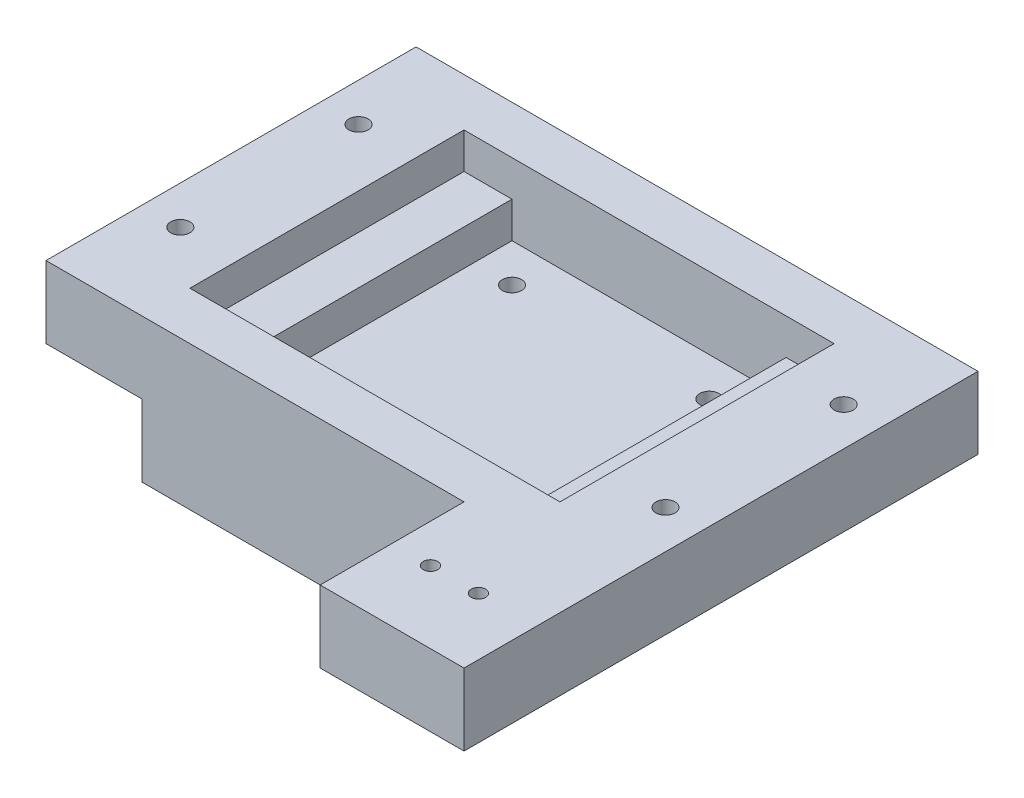
ISO-10303-21;
HEADER;
FILE_DESCRIPTION(('STEP AP214'),'2;1');
FILE_NAME('part.step','',(''),(''),'','','');
FILE_SCHEMA(('AUTOMOTIVE_DESIGN { 1 0 10303 214 1 1 1 1 }'));
ENDSEC;
DATA;
#1=APPLICATION_CONTEXT('core data for automotive mechanical design processes');
#2=APPLICATION_PROTOCOL_DEFINITION('international standard','automotive_design',2000,#1);
#3=PRODUCT_CONTEXT('',#1,'mechanical');
#4=PRODUCT('Part','Part','',(#3));
#5=PRODUCT_RELATED_PRODUCT_CATEGORY('part','',(#4));
#6=PRODUCT_DEFINITION_FORMATION('','',#4);
#7=PRODUCT_DEFINITION_CONTEXT('part definition',#1,'design');
#8=PRODUCT_DEFINITION('design','',#6,#7);
#9=PRODUCT_DEFINITION_SHAPE('','',#8);
#10=(LENGTH_UNIT() NAMED_UNIT(*) SI_UNIT(.MILLI.,.METRE.));
#11=(NAMED_UNIT(*) PLANE_ANGLE_UNIT() SI_UNIT($,.RADIAN.));
#12=(NAMED_UNIT(*) SI_UNIT($,.STERADIAN.) SOLID_ANGLE_UNIT());
#13=UNCERTAINTY_MEASURE_WITH_UNIT(LENGTH_MEASURE(1.E-05),#10,'distance_accuracy_value','');
#14=(GEOMETRIC_REPRESENTATION_CONTEXT(3) GLOBAL_UNCERTAINTY_ASSIGNED_CONTEXT((#13)) GLOBAL_UNIT_ASSIGNED_CONTEXT((#10,
#11,#12)) REPRESENTATION_CONTEXT('',''));
#15=CARTESIAN_POINT('',(0.,0.,0.));
#16=DIRECTION('',(0.,0.,1.));
#17=DIRECTION('',(1.,0.,0.));
#18=AXIS2_PLACEMENT_3D('',#15,#16,#17);
#19=CARTESIAN_POINT('',(0.,15.,0.));
#20=DIRECTION('',(0.,1.,0.));
#21=DIRECTION('',(0.,0.,1.));
#22=AXIS2_PLACEMENT_3D('',#19,#20,#21);
#23=PLANE('',#22);
#24=CARTESIAN_POINT('',(-50.575,15.,18.575));
#25=DIRECTION('',(0.,1.,0.));
#26=DIRECTION('',(0.,0.,1.));
#27=AXIS2_PLACEMENT_3D('',#24,#25,#26);
#28=CIRCLE('',#27,2.);
#29=CARTESIAN_POINT('',(-50.575,15.,20.575));
#30=VERTEX_POINT('',#29);
#31=EDGE_CURVE('E342',#30,#30,#28,.T.);
#32=ORIENTED_EDGE('',*,*,#31,.T.);
#33=EDGE_LOOP('',(#32));
#34=FACE_BOUND('',#33,.T.);
#35=CARTESIAN_POINT('',(-50.575,15.,-18.575));
#36=DIRECTION('',(0.,1.,0.));
#37=DIRECTION('',(0.,0.,1.));
#38=AXIS2_PLACEMENT_3D('',#35,#36,#37);
#39=CIRCLE('',#38,2.);
#40=CARTESIAN_POINT('',(-50.575,15.,-16.575));
#41=VERTEX_POINT('',#40);
#42=EDGE_CURVE('E229',#41,#41,#39,.T.);
#43=ORIENTED_EDGE('',*,*,#42,.T.);
#44=EDGE_LOOP('',(#43));
#45=FACE_BOUND('',#44,.T.);
#46=DIRECTION('',(0.,0.,1.));
#47=VECTOR('',#46,1.);
#48=CARTESIAN_POINT('',(-38.575,15.,0.));
#49=LINE('',#48,#47);
#50=CARTESIAN_POINT('',(-38.575,15.,-38.575));
#51=VERTEX_POINT('',#50);
#52=CARTESIAN_POINT('',(-38.575,15.,38.575));
#53=VERTEX_POINT('',#52);
#54=EDGE_CURVE('E295',#51,#53,#49,.T.);
#55=ORIENTED_EDGE('',*,*,#54,.T.);
#56=DIRECTION('',(-1.,0.,0.));
#57=VECTOR('',#56,1.);
#58=CARTESIAN_POINT('',(0.,15.,38.575));
#59=LINE('',#58,#57);
#60=CARTESIAN_POINT('',(-58.575,15.,38.575));
#61=VERTEX_POINT('',#60);
#62=EDGE_CURVE('E11',#53,#61,#59,.T.);
#63=ORIENTED_EDGE('',*,*,#62,.T.);
#64=DIRECTION('',(0.,0.,1.));
#65=VECTOR('',#64,1.);
#66=CARTESIAN_POINT('',(-58.575,15.,0.));
#67=LINE('',#66,#65);
#68=CARTESIAN_POINT('',(-58.575,15.,-38.575));
#69=VERTEX_POINT('',#68);
#70=EDGE_CURVE('E283',#69,#61,#67,.T.);
#71=ORIENTED_EDGE('',*,*,#70,.F.);
#72=DIRECTION('',(-1.,0.,0.));
#73=VECTOR('',#72,1.);
#74=CARTESIAN_POINT('',(0.,15.,-38.575));
#75=LINE('',#74,#73);
#76=EDGE_CURVE('E288',#51,#69,#75,.T.);
#77=ORIENTED_EDGE('',*,*,#76,.F.);
#78=EDGE_LOOP('',(#55,#63,#71,#77));
#79=FACE_BOUND('',#78,.T.);
#80=ADVANCED_FACE('F35',(#34,#45,#79),#23,.F.);
#81=CARTESIAN_POINT('',(-38.575,15.,38.575));
#82=DIRECTION('',(0.,0.,-1.));
#83=DIRECTION('',(-1.,0.,0.));
#84=AXIS2_PLACEMENT_3D('',#81,#82,#83);
#85=PLANE('',#84);
#86=DIRECTION('',(1.,0.,0.));
#87=VECTOR('',#86,1.);
#88=CARTESIAN_POINT('',(-58.575,15.,38.575));
#89=LINE('',#88,#87);
#90=CARTESIAN_POINT('',(28.575,15.,38.575));
#91=VERTEX_POINT('',#90);
#92=CARTESIAN_POINT('',(38.575,15.,38.575));
#93=VERTEX_POINT('',#92);
#94=EDGE_CURVE('E167',#91,#93,#89,.T.);
#95=ORIENTED_EDGE('',*,*,#94,.F.);
#96=DIRECTION('',(0.,1.,0.));
#97=VECTOR('',#96,1.);
#98=CARTESIAN_POINT('',(28.575,-10.,38.575));
#99=LINE('',#98,#97);
#100=CARTESIAN_POINT('',(28.575,30.,38.575));
#101=VERTEX_POINT('',#100);
#102=EDGE_CURVE('E507',#91,#101,#99,.T.);
#103=ORIENTED_EDGE('',*,*,#102,.T.);
#104=DIRECTION('',(-1.,0.,0.));
#105=VECTOR('',#104,1.);
#106=CARTESIAN_POINT('',(28.575,30.,38.575));
#107=LINE('',#106,#105);
#108=CARTESIAN_POINT('',(-58.575,30.,38.575));
#109=VERTEX_POINT('',#108);
#110=EDGE_CURVE('E175',#101,#109,#107,.T.);
#111=ORIENTED_EDGE('',*,*,#110,.T.);
#112=DIRECTION('',(0.,1.,0.));
#113=VECTOR('',#112,1.);
#114=CARTESIAN_POINT('',(-58.575,-10.,38.575));
#115=LINE('',#114,#113);
#116=EDGE_CURVE('E185',#61,#109,#115,.T.);
#117=ORIENTED_EDGE('',*,*,#116,.F.);
#118=ORIENTED_EDGE('',*,*,#62,.F.);
#119=DIRECTION('',(0.,-1.,0.));
#120=VECTOR('',#119,1.);
#121=CARTESIAN_POINT('',(-38.575,15.,38.575));
#122=LINE('',#121,#120);
#123=CARTESIAN_POINT('',(-38.575,0.,38.575));
#124=VERTEX_POINT('',#123);
#125=EDGE_CURVE('E192',#53,#124,#122,.T.);
#126=ORIENTED_EDGE('',*,*,#125,.T.);
#127=DIRECTION('',(1.,0.,0.));
#128=VECTOR('',#127,1.);
#129=CARTESIAN_POINT('',(-38.575,0.,38.575));
#130=LINE('',#129,#128);
#131=CARTESIAN_POINT('',(38.575,0.,38.575));
#132=VERTEX_POINT('',#131);
#133=EDGE_CURVE('E310',#124,#132,#130,.T.);
#134=ORIENTED_EDGE('',*,*,#133,.T.);
#135=DIRECTION('',(0.,-1.,0.));
#136=VECTOR('',#135,1.);
#137=CARTESIAN_POINT('',(38.575,15.,38.575));
#138=LINE('',#137,#136);
#139=EDGE_CURVE('E322',#93,#132,#138,.T.);
#140=ORIENTED_EDGE('',*,*,#139,.F.);
#141=EDGE_LOOP('',(#95,#103,#111,#117,#118,#126,#134,#140));
#142=FACE_BOUND('',#141,.T.);
#143=ADVANCED_FACE('F368',(#142),#85,.F.);
#144=CARTESIAN_POINT('',(-38.575,15.,38.575));
#145=DIRECTION('',(1.,0.,0.));
#146=DIRECTION('',(0.,0.,-1.));
#147=AXIS2_PLACEMENT_3D('',#144,#145,#146);
#148=PLANE('',#147);
#149=ORIENTED_EDGE('',*,*,#125,.F.);
#150=ORIENTED_EDGE('',*,*,#54,.F.);
#151=DIRECTION('',(0.,-1.,0.));
#152=VECTOR('',#151,1.);
#153=CARTESIAN_POINT('',(-38.575,15.,-38.575));
#154=LINE('',#153,#152);
#155=CARTESIAN_POINT('',(-38.575,0.,-38.575));
#156=VERTEX_POINT('',#155);
#157=EDGE_CURVE('E317',#51,#156,#154,.T.);
#158=ORIENTED_EDGE('',*,*,#157,.T.);
#159=DIRECTION('',(0.,0.,1.));
#160=VECTOR('',#159,1.);
#161=CARTESIAN_POINT('',(-38.575,0.,38.575));
#162=LINE('',#161,#160);
#163=EDGE_CURVE('E307',#156,#124,#162,.T.);
#164=ORIENTED_EDGE('',*,*,#163,.T.);
#165=EDGE_LOOP('',(#149,#150,#158,#164));
#166=FACE_BOUND('',#165,.T.);
#167=ADVANCED_FACE('F37',(#166),#148,.F.);
#168=CARTESIAN_POINT('',(0.,15.,0.));
#169=DIRECTION('',(0.,-1.,0.));
#170=DIRECTION('',(0.,0.,-1.));
#171=AXIS2_PLACEMENT_3D('',#168,#169,#170);
#172=PLANE('',#171);
#173=CARTESIAN_POINT('',(-20.575,15.,-20.575));
#174=DIRECTION('',(0.,1.,0.));
#175=DIRECTION('',(0.,0.,1.));
#176=AXIS2_PLACEMENT_3D('',#173,#174,#175);
#177=CIRCLE('',#176,2.00000000000001);
#178=CARTESIAN_POINT('',(-20.575,15.,-18.575));
#179=VERTEX_POINT('',#178);
#180=EDGE_CURVE('E230',#179,#179,#177,.T.);
#181=ORIENTED_EDGE('',*,*,#180,.F.);
#182=EDGE_LOOP('',(#181));
#183=FACE_BOUND('',#182,.T.);
#184=CARTESIAN_POINT('',(20.575,15.,20.575));
#185=DIRECTION('',(0.,1.,0.));
#186=DIRECTION('',(0.,0.,1.));
#187=AXIS2_PLACEMENT_3D('',#184,#185,#186);
#188=CIRCLE('',#187,2.);
#189=CARTESIAN_POINT('',(20.575,15.,22.575));
#190=VERTEX_POINT('',#189);
#191=EDGE_CURVE('E228',#190,#190,#188,.T.);
#192=ORIENTED_EDGE('',*,*,#191,.F.);
#193=EDGE_LOOP('',(#192));
#194=FACE_BOUND('',#193,.T.);
#195=CARTESIAN_POINT('',(-20.575,15.,20.575));
#196=DIRECTION('',(0.,1.,0.));
#197=DIRECTION('',(0.,0.,1.));
#198=AXIS2_PLACEMENT_3D('',#195,#196,#197);
#199=CIRCLE('',#198,2.00000000000001);
#200=CARTESIAN_POINT('',(-20.575,15.,22.575));
#201=VERTEX_POINT('',#200);
#202=EDGE_CURVE('E225',#201,#201,#199,.T.);
#203=ORIENTED_EDGE('',*,*,#202,.F.);
#204=EDGE_LOOP('',(#203));
#205=FACE_BOUND('',#204,.T.);
#206=CARTESIAN_POINT('',(20.575,15.,-20.575));
#207=DIRECTION('',(0.,1.,0.));
#208=DIRECTION('',(0.,0.,1.));
#209=AXIS2_PLACEMENT_3D('',#206,#207,#208);
#210=CIRCLE('',#209,2.);
#211=CARTESIAN_POINT('',(20.575,15.,-18.575));
#212=VERTEX_POINT('',#211);
#213=EDGE_CURVE('E233',#212,#212,#210,.T.);
#214=ORIENTED_EDGE('',*,*,#213,.F.);
#215=EDGE_LOOP('',(#214));
#216=FACE_BOUND('',#215,.T.);
#217=DIRECTION('',(0.,0.,-1.));
#218=VECTOR('',#217,1.);
#219=CARTESIAN_POINT('',(28.575,15.,0.));
#220=LINE('',#219,#218);
#221=CARTESIAN_POINT('',(28.575,15.,28.575));
#222=VERTEX_POINT('',#221);
#223=CARTESIAN_POINT('',(28.575,15.,-28.575));
#224=VERTEX_POINT('',#223);
#225=EDGE_CURVE('E277',#222,#224,#220,.T.);
#226=ORIENTED_EDGE('',*,*,#225,.T.);
#227=DIRECTION('',(-1.,0.,0.));
#228=VECTOR('',#227,1.);
#229=CARTESIAN_POINT('',(0.,15.,-28.575));
#230=LINE('',#229,#228);
#231=CARTESIAN_POINT('',(-28.575,15.,-28.575));
#232=VERTEX_POINT('',#231);
#233=EDGE_CURVE('E58',#224,#232,#230,.T.);
#234=ORIENTED_EDGE('',*,*,#233,.T.);
#235=DIRECTION('',(0.,0.,-1.));
#236=VECTOR('',#235,1.);
#237=CARTESIAN_POINT('',(-28.575,15.,0.));
#238=LINE('',#237,#236);
#239=CARTESIAN_POINT('',(-28.575,15.,28.575));
#240=VERTEX_POINT('',#239);
#241=EDGE_CURVE('E301',#240,#232,#238,.T.);
#242=ORIENTED_EDGE('',*,*,#241,.F.);
#243=DIRECTION('',(1.,0.,0.));
#244=VECTOR('',#243,1.);
#245=CARTESIAN_POINT('',(0.,15.,28.575));
#246=LINE('',#245,#244);
#247=EDGE_CURVE('E250',#240,#222,#246,.T.);
#248=ORIENTED_EDGE('',*,*,#247,.T.);
#249=EDGE_LOOP('',(#226,#234,#242,#248));
#250=FACE_BOUND('',#249,.T.);
#251=ADVANCED_FACE('F457',(#183,#194,#205,#216,#250),#172,.F.);
#252=CARTESIAN_POINT('',(38.575,15.,38.575));
#253=DIRECTION('',(-1.,0.,0.));
#254=DIRECTION('',(0.,0.,1.));
#255=AXIS2_PLACEMENT_3D('',#252,#253,#254);
#256=PLANE('',#255);
#257=DIRECTION('',(0.,0.,-1.));
#258=VECTOR('',#257,1.);
#259=CARTESIAN_POINT('',(38.575,0.,38.575));
#260=LINE('',#259,#258);
#261=CARTESIAN_POINT('',(38.575,0.,-38.575));
#262=VERTEX_POINT('',#261);
#263=EDGE_CURVE('E312',#132,#262,#260,.T.);
#264=ORIENTED_EDGE('',*,*,#263,.T.);
#265=DIRECTION('',(0.,-1.,0.));
#266=VECTOR('',#265,1.);
#267=CARTESIAN_POINT('',(38.575,15.,-38.575));
#268=LINE('',#267,#266);
#269=CARTESIAN_POINT('',(38.575,15.,-38.575));
#270=VERTEX_POINT('',#269);
#271=EDGE_CURVE('E319',#270,#262,#268,.T.);
#272=ORIENTED_EDGE('',*,*,#271,.F.);
#273=DIRECTION('',(0.,0.,1.));
#274=VECTOR('',#273,1.);
#275=CARTESIAN_POINT('',(38.575,15.,0.));
#276=LINE('',#275,#274);
#277=EDGE_CURVE('E266',#270,#93,#276,.T.);
#278=ORIENTED_EDGE('',*,*,#277,.T.);
#279=ORIENTED_EDGE('',*,*,#139,.T.);
#280=EDGE_LOOP('',(#264,#272,#278,#279));
#281=FACE_BOUND('',#280,.T.);
#282=ADVANCED_FACE('F459',(#281),#256,.F.);
#283=CARTESIAN_POINT('',(-38.575,15.,-38.575));
#284=DIRECTION('',(0.,0.,1.));
#285=DIRECTION('',(1.,0.,0.));
#286=AXIS2_PLACEMENT_3D('',#283,#284,#285);
#287=PLANE('',#286);
#288=CARTESIAN_POINT('',(0.,20.,-38.575));
#289=DIRECTION('',(0.,0.,-1.));
#290=DIRECTION('',(-1.,0.,0.));
#291=AXIS2_PLACEMENT_3D('',#288,#289,#290);
#292=CIRCLE('',#291,1.25);
#293=CARTESIAN_POINT('',(-1.25000000000001,20.,-38.575));
#294=VERTEX_POINT('',#293);
#295=EDGE_CURVE('E488',#294,#294,#292,.T.);
#296=ORIENTED_EDGE('',*,*,#295,.F.);
#297=EDGE_LOOP('',(#296));
#298=FACE_BOUND('',#297,.T.);
#299=DIRECTION('',(-1.,0.,0.));
#300=VECTOR('',#299,1.);
#301=CARTESIAN_POINT('',(0.,30.,-38.575));
#302=LINE('',#301,#300);
#303=CARTESIAN_POINT('',(58.575,30.,-38.575));
#304=VERTEX_POINT('',#303);
#305=CARTESIAN_POINT('',(-58.575,30.,-38.575));
#306=VERTEX_POINT('',#305);
#307=EDGE_CURVE('E290',#304,#306,#302,.T.);
#308=ORIENTED_EDGE('',*,*,#307,.F.);
#309=DIRECTION('',(0.,-1.,0.));
#310=VECTOR('',#309,1.);
#311=CARTESIAN_POINT('',(58.575,30.,-38.575));
#312=LINE('',#311,#310);
#313=CARTESIAN_POINT('',(58.575,15.,-38.575));
#314=VERTEX_POINT('',#313);
#315=EDGE_CURVE('E268',#304,#314,#312,.T.);
#316=ORIENTED_EDGE('',*,*,#315,.T.);
#317=DIRECTION('',(1.,0.,0.));
#318=VECTOR('',#317,1.);
#319=CARTESIAN_POINT('',(0.,15.,-38.575));
#320=LINE('',#319,#318);
#321=EDGE_CURVE('E271',#270,#314,#320,.T.);
#322=ORIENTED_EDGE('',*,*,#321,.F.);
#323=ORIENTED_EDGE('',*,*,#271,.T.);
#324=DIRECTION('',(-1.,0.,0.));
#325=VECTOR('',#324,1.);
#326=CARTESIAN_POINT('',(-38.575,0.,-38.575));
#327=LINE('',#326,#325);
#328=EDGE_CURVE('E314',#262,#156,#327,.T.);
#329=ORIENTED_EDGE('',*,*,#328,.T.);
#330=ORIENTED_EDGE('',*,*,#157,.F.);
#331=ORIENTED_EDGE('',*,*,#76,.T.);
#332=DIRECTION('',(0.,-1.,0.));
#333=VECTOR('',#332,1.);
#334=CARTESIAN_POINT('',(-58.575,30.,-38.575));
#335=LINE('',#334,#333);
#336=EDGE_CURVE('E292',#306,#69,#335,.T.);
#337=ORIENTED_EDGE('',*,*,#336,.F.);
#338=EDGE_LOOP('',(#308,#316,#322,#323,#329,#330,#331,#337));
#339=FACE_BOUND('',#338,.T.);
#340=ADVANCED_FACE('F466',(#298,#339),#287,.F.);
#341=CARTESIAN_POINT('',(0.,0.,0.));
#342=DIRECTION('',(0.,-1.,0.));
#343=DIRECTION('',(0.,0.,-1.));
#344=AXIS2_PLACEMENT_3D('',#341,#342,#343);
#345=PLANE('',#344);
#346=ORIENTED_EDGE('',*,*,#133,.F.);
#347=ORIENTED_EDGE('',*,*,#163,.F.);
#348=ORIENTED_EDGE('',*,*,#328,.F.);
#349=ORIENTED_EDGE('',*,*,#263,.F.);
#350=EDGE_LOOP('',(#346,#347,#348,#349));
#351=FACE_BOUND('',#350,.T.);
#352=CARTESIAN_POINT('',(-20.575,0.,-20.575));
#353=DIRECTION('',(0.,-1.,0.));
#354=DIRECTION('',(0.,0.,-1.));
#355=AXIS2_PLACEMENT_3D('',#352,#353,#354);
#356=CIRCLE('',#355,2.00000000000001);
#357=CARTESIAN_POINT('',(-20.575,0.,-22.575));
#358=VERTEX_POINT('',#357);
#359=EDGE_CURVE('E243',#358,#358,#356,.T.);
#360=ORIENTED_EDGE('',*,*,#359,.F.);
#361=EDGE_LOOP('',(#360));
#362=FACE_BOUND('',#361,.T.);
#363=CARTESIAN_POINT('',(20.575,0.,20.575));
#364=DIRECTION('',(0.,-1.,0.));
#365=DIRECTION('',(0.,0.,-1.));
#366=AXIS2_PLACEMENT_3D('',#363,#364,#365);
#367=CIRCLE('',#366,2.);
#368=CARTESIAN_POINT('',(20.575,0.,18.575));
#369=VERTEX_POINT('',#368);
#370=EDGE_CURVE('E332',#369,#369,#367,.T.);
#371=ORIENTED_EDGE('',*,*,#370,.F.);
#372=EDGE_LOOP('',(#371));
#373=FACE_BOUND('',#372,.T.);
#374=CARTESIAN_POINT('',(-20.575,0.,20.575));
#375=DIRECTION('',(0.,-1.,0.));
#376=DIRECTION('',(0.,0.,-1.));
#377=AXIS2_PLACEMENT_3D('',#374,#375,#376);
#378=CIRCLE('',#377,2.00000000000001);
#379=CARTESIAN_POINT('',(-20.575,0.,18.575));
#380=VERTEX_POINT('',#379);
#381=EDGE_CURVE('E329',#380,#380,#378,.T.);
#382=ORIENTED_EDGE('',*,*,#381,.F.);
#383=EDGE_LOOP('',(#382));
#384=FACE_BOUND('',#383,.T.);
#385=CARTESIAN_POINT('',(20.575,0.,-20.575));
#386=DIRECTION('',(0.,-1.,0.));
#387=DIRECTION('',(0.,0.,-1.));
#388=AXIS2_PLACEMENT_3D('',#385,#386,#387);
#389=CIRCLE('',#388,2.);
#390=CARTESIAN_POINT('',(20.575,0.,-22.575));
#391=VERTEX_POINT('',#390);
#392=EDGE_CURVE('E238',#391,#391,#389,.T.);
#393=ORIENTED_EDGE('',*,*,#392,.F.);
#394=EDGE_LOOP('',(#393));
#395=FACE_BOUND('',#394,.T.);
#396=ADVANCED_FACE('F475',(#351,#362,#373,#384,#395),#345,.T.);
#397=CARTESIAN_POINT('',(-28.575,22.5,0.));
#398=DIRECTION('',(-1.,0.,0.));
#399=DIRECTION('',(0.,0.,1.));
#400=AXIS2_PLACEMENT_3D('',#397,#398,#399);
#401=PLANE('',#400);
#402=ORIENTED_EDGE('',*,*,#241,.T.);
#403=DIRECTION('',(0.,1.,0.));
#404=VECTOR('',#403,1.);
#405=CARTESIAN_POINT('',(-28.575,22.5,-28.575));
#406=LINE('',#405,#404);
#407=CARTESIAN_POINT('',(-28.575,22.5,-28.575));
#408=VERTEX_POINT('',#407);
#409=EDGE_CURVE('E204',#232,#408,#406,.T.);
#410=ORIENTED_EDGE('',*,*,#409,.T.);
#411=DIRECTION('',(0.,0.,-1.));
#412=VECTOR('',#411,1.);
#413=CARTESIAN_POINT('',(-28.575,22.5,0.));
#414=LINE('',#413,#412);
#415=CARTESIAN_POINT('',(-28.575,22.5,28.575));
#416=VERTEX_POINT('',#415);
#417=EDGE_CURVE('E302',#416,#408,#414,.T.);
#418=ORIENTED_EDGE('',*,*,#417,.F.);
#419=DIRECTION('',(0.,-1.,0.));
#420=VECTOR('',#419,1.);
#421=CARTESIAN_POINT('',(-28.575,22.5,28.575));
#422=LINE('',#421,#420);
#423=EDGE_CURVE('E253',#416,#240,#422,.T.);
#424=ORIENTED_EDGE('',*,*,#423,.T.);
#425=EDGE_LOOP('',(#402,#410,#418,#424));
#426=FACE_BOUND('',#425,.T.);
#427=ADVANCED_FACE('F444',(#426),#401,.F.);
#428=CARTESIAN_POINT('',(0.,22.5,0.));
#429=DIRECTION('',(0.,1.,0.));
#430=DIRECTION('',(0.,0.,1.));
#431=AXIS2_PLACEMENT_3D('',#428,#429,#430);
#432=PLANE('',#431);
#433=DIRECTION('',(1.,0.,0.));
#434=VECTOR('',#433,1.);
#435=CARTESIAN_POINT('',(0.,22.5,-28.575));
#436=LINE('',#435,#434);
#437=CARTESIAN_POINT('',(-38.575,22.5,-28.575));
#438=VERTEX_POINT('',#437);
#439=EDGE_CURVE('E206',#438,#408,#436,.T.);
#440=ORIENTED_EDGE('',*,*,#439,.F.);
#441=DIRECTION('',(0.,0.,1.));
#442=VECTOR('',#441,1.);
#443=CARTESIAN_POINT('',(-38.575,22.5,0.));
#444=LINE('',#443,#442);
#445=CARTESIAN_POINT('',(-38.575,22.5,28.575));
#446=VERTEX_POINT('',#445);
#447=EDGE_CURVE('E305',#438,#446,#444,.T.);
#448=ORIENTED_EDGE('',*,*,#447,.T.);
#449=DIRECTION('',(-1.,0.,0.));
#450=VECTOR('',#449,1.);
#451=CARTESIAN_POINT('',(0.,22.5,28.575));
#452=LINE('',#451,#450);
#453=EDGE_CURVE('E256',#416,#446,#452,.T.);
#454=ORIENTED_EDGE('',*,*,#453,.F.);
#455=ORIENTED_EDGE('',*,*,#417,.T.);
#456=EDGE_LOOP('',(#440,#448,#454,#455));
#457=FACE_BOUND('',#456,.T.);
#458=ADVANCED_FACE('F447',(#457),#432,.T.);
#459=CARTESIAN_POINT('',(-38.575,30.,0.));
#460=DIRECTION('',(1.,0.,0.));
#461=DIRECTION('',(0.,0.,-1.));
#462=AXIS2_PLACEMENT_3D('',#459,#460,#461);
#463=PLANE('',#462);
#464=DIRECTION('',(0.,-1.,0.));
#465=VECTOR('',#464,1.);
#466=CARTESIAN_POINT('',(-38.575,30.,-28.575));
#467=LINE('',#466,#465);
#468=CARTESIAN_POINT('',(-38.575,30.,-28.575));
#469=VERTEX_POINT('',#468);
#470=EDGE_CURVE('E209',#469,#438,#467,.T.);
#471=ORIENTED_EDGE('',*,*,#470,.F.);
#472=DIRECTION('',(0.,0.,1.));
#473=VECTOR('',#472,1.);
#474=CARTESIAN_POINT('',(-38.575,30.,0.));
#475=LINE('',#474,#473);
#476=CARTESIAN_POINT('',(-38.575,30.,28.575));
#477=VERTEX_POINT('',#476);
#478=EDGE_CURVE('E287',#469,#477,#475,.T.);
#479=ORIENTED_EDGE('',*,*,#478,.T.);
#480=DIRECTION('',(0.,1.,0.));
#481=VECTOR('',#480,1.);
#482=CARTESIAN_POINT('',(-38.575,30.,28.575));
#483=LINE('',#482,#481);
#484=EDGE_CURVE('E259',#446,#477,#483,.T.);
#485=ORIENTED_EDGE('',*,*,#484,.F.);
#486=ORIENTED_EDGE('',*,*,#447,.F.);
#487=EDGE_LOOP('',(#471,#479,#485,#486));
#488=FACE_BOUND('',#487,.T.);
#489=ADVANCED_FACE('F452',(#488),#463,.T.);
#490=CARTESIAN_POINT('',(-58.575,30.,0.));
#491=DIRECTION('',(1.,0.,0.));
#492=DIRECTION('',(0.,0.,-1.));
#493=AXIS2_PLACEMENT_3D('',#490,#491,#492);
#494=PLANE('',#493);
#495=ORIENTED_EDGE('',*,*,#70,.T.);
#496=ORIENTED_EDGE('',*,*,#116,.T.);
#497=DIRECTION('',(0.,0.,1.));
#498=VECTOR('',#497,1.);
#499=CARTESIAN_POINT('',(-58.575,30.,0.));
#500=LINE('',#499,#498);
#501=EDGE_CURVE('E285',#306,#109,#500,.T.);
#502=ORIENTED_EDGE('',*,*,#501,.F.);
#503=ORIENTED_EDGE('',*,*,#336,.T.);
#504=EDGE_LOOP('',(#495,#496,#502,#503));
#505=FACE_BOUND('',#504,.T.);
#506=ADVANCED_FACE('F388',(#505),#494,.F.);
#507=CARTESIAN_POINT('',(0.,30.,0.));
#508=DIRECTION('',(0.,1.,0.));
#509=DIRECTION('',(0.,0.,1.));
#510=AXIS2_PLACEMENT_3D('',#507,#508,#509);
#511=PLANE('',#510);
#512=CARTESIAN_POINT('',(36.575,30.,53.575));
#513=DIRECTION('',(0.,1.,0.));
#514=DIRECTION('',(0.,0.,1.));
#515=AXIS2_PLACEMENT_3D('',#512,#513,#514);
#516=CIRCLE('',#515,1.5);
#517=CARTESIAN_POINT('',(36.575,30.,55.075));
#518=VERTEX_POINT('',#517);
#519=EDGE_CURVE('E518',#518,#518,#516,.T.);
#520=ORIENTED_EDGE('',*,*,#519,.F.);
#521=EDGE_LOOP('',(#520));
#522=FACE_BOUND('',#521,.T.);
#523=CARTESIAN_POINT('',(46.575,30.,53.575));
#524=DIRECTION('',(0.,1.,0.));
#525=DIRECTION('',(0.,0.,1.));
#526=AXIS2_PLACEMENT_3D('',#523,#524,#525);
#527=CIRCLE('',#526,1.5);
#528=CARTESIAN_POINT('',(46.575,30.,55.075));
#529=VERTEX_POINT('',#528);
#530=EDGE_CURVE('E511',#529,#529,#527,.T.);
#531=ORIENTED_EDGE('',*,*,#530,.F.);
#532=EDGE_LOOP('',(#531));
#533=FACE_BOUND('',#532,.T.);
#534=ORIENTED_EDGE('',*,*,#110,.F.);
#535=DIRECTION('',(0.,0.,-1.));
#536=VECTOR('',#535,1.);
#537=CARTESIAN_POINT('',(28.575,30.,68.575));
#538=LINE('',#537,#536);
#539=CARTESIAN_POINT('',(28.575,30.,68.575));
#540=VERTEX_POINT('',#539);
#541=EDGE_CURVE('E162',#540,#101,#538,.T.);
#542=ORIENTED_EDGE('',*,*,#541,.F.);
#543=DIRECTION('',(-1.,0.,0.));
#544=VECTOR('',#543,1.);
#545=CARTESIAN_POINT('',(58.575,30.,68.575));
#546=LINE('',#545,#544);
#547=CARTESIAN_POINT('',(58.575,30.,68.575));
#548=VERTEX_POINT('',#547);
#549=EDGE_CURVE('E173',#548,#540,#546,.T.);
#550=ORIENTED_EDGE('',*,*,#549,.F.);
#551=DIRECTION('',(0.,0.,1.));
#552=VECTOR('',#551,1.);
#553=CARTESIAN_POINT('',(58.575,30.,0.));
#554=LINE('',#553,#552);
#555=EDGE_CURVE('E263',#304,#548,#554,.T.);
#556=ORIENTED_EDGE('',*,*,#555,.F.);
#557=ORIENTED_EDGE('',*,*,#307,.T.);
#558=ORIENTED_EDGE('',*,*,#501,.T.);
#559=EDGE_LOOP('',(#534,#542,#550,#556,#557,#558));
#560=FACE_BOUND('',#559,.T.);
#561=ORIENTED_EDGE('',*,*,#478,.F.);
#562=DIRECTION('',(-1.,0.,0.));
#563=VECTOR('',#562,1.);
#564=CARTESIAN_POINT('',(-58.575,30.,-28.575));
#565=LINE('',#564,#563);
#566=CARTESIAN_POINT('',(38.575,30.,-28.575));
#567=VERTEX_POINT('',#566);
#568=EDGE_CURVE('E190',#567,#469,#565,.T.);
#569=ORIENTED_EDGE('',*,*,#568,.F.);
#570=DIRECTION('',(0.,0.,1.));
#571=VECTOR('',#570,1.);
#572=CARTESIAN_POINT('',(38.575,30.,0.));
#573=LINE('',#572,#571);
#574=CARTESIAN_POINT('',(38.575,30.,28.575));
#575=VERTEX_POINT('',#574);
#576=EDGE_CURVE('E265',#567,#575,#573,.T.);
#577=ORIENTED_EDGE('',*,*,#576,.T.);
#578=DIRECTION('',(-1.,0.,0.));
#579=VECTOR('',#578,1.);
#580=CARTESIAN_POINT('',(38.575,30.,28.575));
#581=LINE('',#580,#579);
#582=EDGE_CURVE('E239',#575,#477,#581,.T.);
#583=ORIENTED_EDGE('',*,*,#582,.T.);
#584=EDGE_LOOP('',(#561,#569,#577,#583));
#585=FACE_BOUND('',#584,.T.);
#586=CARTESIAN_POINT('',(50.575,30.,18.575));
#587=DIRECTION('',(0.,1.,0.));
#588=DIRECTION('',(0.,0.,1.));
#589=AXIS2_PLACEMENT_3D('',#586,#587,#588);
#590=CIRCLE('',#589,2.);
#591=CARTESIAN_POINT('',(50.575,30.,20.575));
#592=VERTEX_POINT('',#591);
#593=EDGE_CURVE('E216',#592,#592,#590,.T.);
#594=ORIENTED_EDGE('',*,*,#593,.F.);
#595=EDGE_LOOP('',(#594));
#596=FACE_BOUND('',#595,.T.);
#597=CARTESIAN_POINT('',(-50.575,30.,-18.575));
#598=DIRECTION('',(0.,1.,0.));
#599=DIRECTION('',(0.,0.,1.));
#600=AXIS2_PLACEMENT_3D('',#597,#598,#599);
#601=CIRCLE('',#600,2.);
#602=CARTESIAN_POINT('',(-50.575,30.,-16.575));
#603=VERTEX_POINT('',#602);
#604=EDGE_CURVE('E215',#603,#603,#601,.T.);
#605=ORIENTED_EDGE('',*,*,#604,.F.);
#606=EDGE_LOOP('',(#605));
#607=FACE_BOUND('',#606,.T.);
#608=CARTESIAN_POINT('',(-50.575,30.,18.575));
#609=DIRECTION('',(0.,1.,0.));
#610=DIRECTION('',(0.,0.,1.));
#611=AXIS2_PLACEMENT_3D('',#608,#609,#610);
#612=CIRCLE('',#611,2.);
#613=CARTESIAN_POINT('',(-50.575,30.,20.575));
#614=VERTEX_POINT('',#613);
#615=EDGE_CURVE('E212',#614,#614,#612,.T.);
#616=ORIENTED_EDGE('',*,*,#615,.F.);
#617=EDGE_LOOP('',(#616));
#618=FACE_BOUND('',#617,.T.);
#619=CARTESIAN_POINT('',(50.575,30.,-18.575));
#620=DIRECTION('',(0.,1.,0.));
#621=DIRECTION('',(0.,0.,1.));
#622=AXIS2_PLACEMENT_3D('',#619,#620,#621);
#623=CIRCLE('',#622,2.);
#624=CARTESIAN_POINT('',(50.575,30.,-16.575));
#625=VERTEX_POINT('',#624);
#626=EDGE_CURVE('E219',#625,#625,#623,.T.);
#627=ORIENTED_EDGE('',*,*,#626,.F.);
#628=EDGE_LOOP('',(#627));
#629=FACE_BOUND('',#628,.T.);
#630=ADVANCED_FACE('F170',(#522,#533,#560,#585,#596,#607,#618,#629),#511,.T.);
#631=DIRECTION('',(1.,0.,0.));
#632=VECTOR('',#631,1.);
#633=CARTESIAN_POINT('',(-58.575,15.,68.575));
#634=LINE('',#633,#632);
#635=CARTESIAN_POINT('',(28.575,15.,68.575));
#636=VERTEX_POINT('',#635);
#637=CARTESIAN_POINT('',(58.575,15.,68.575));
#638=VERTEX_POINT('',#637);
#639=EDGE_CURVE('E182',#636,#638,#634,.T.);
#640=ORIENTED_EDGE('',*,*,#639,.F.);
#641=DIRECTION('',(0.,0.,-1.));
#642=VECTOR('',#641,1.);
#643=CARTESIAN_POINT('',(28.575,15.,0.));
#644=LINE('',#643,#642);
#645=EDGE_CURVE('E50',#636,#91,#644,.T.);
#646=ORIENTED_EDGE('',*,*,#645,.T.);
#647=ORIENTED_EDGE('',*,*,#94,.T.);
#648=ORIENTED_EDGE('',*,*,#277,.F.);
#649=ORIENTED_EDGE('',*,*,#321,.T.);
#650=DIRECTION('',(0.,0.,1.));
#651=VECTOR('',#650,1.);
#652=CARTESIAN_POINT('',(58.575,15.,0.));
#653=LINE('',#652,#651);
#654=EDGE_CURVE('E262',#314,#638,#653,.T.);
#655=ORIENTED_EDGE('',*,*,#654,.T.);
#656=EDGE_LOOP('',(#640,#646,#647,#648,#649,#655));
#657=FACE_BOUND('',#656,.T.);
#658=CARTESIAN_POINT('',(50.575,15.,18.575));
#659=DIRECTION('',(0.,1.,0.));
#660=DIRECTION('',(0.,0.,1.));
#661=AXIS2_PLACEMENT_3D('',#658,#659,#660);
#662=CIRCLE('',#661,2.);
#663=CARTESIAN_POINT('',(50.575,15.,20.575));
#664=VERTEX_POINT('',#663);
#665=EDGE_CURVE('E339',#664,#664,#662,.T.);
#666=ORIENTED_EDGE('',*,*,#665,.T.);
#667=EDGE_LOOP('',(#666));
#668=FACE_BOUND('',#667,.T.);
#669=CARTESIAN_POINT('',(50.575,15.,-18.575));
#670=DIRECTION('',(0.,1.,0.));
#671=DIRECTION('',(0.,0.,1.));
#672=AXIS2_PLACEMENT_3D('',#669,#670,#671);
#673=CIRCLE('',#672,2.);
#674=CARTESIAN_POINT('',(50.575,15.,-16.575));
#675=VERTEX_POINT('',#674);
#676=EDGE_CURVE('E224',#675,#675,#673,.T.);
#677=ORIENTED_EDGE('',*,*,#676,.T.);
#678=EDGE_LOOP('',(#677));
#679=FACE_BOUND('',#678,.T.);
#680=ADVANCED_FACE('F371',(#657,#668,#679),#23,.F.);
#681=CARTESIAN_POINT('',(28.575,22.5,0.));
#682=DIRECTION('',(-1.,0.,0.));
#683=DIRECTION('',(0.,0.,1.));
#684=AXIS2_PLACEMENT_3D('',#681,#682,#683);
#685=PLANE('',#684);
#686=DIRECTION('',(0.,1.,0.));
#687=VECTOR('',#686,1.);
#688=CARTESIAN_POINT('',(28.575,22.5,-28.575));
#689=LINE('',#688,#687);
#690=CARTESIAN_POINT('',(28.575,22.5,-28.575));
#691=VERTEX_POINT('',#690);
#692=EDGE_CURVE('E200',#224,#691,#689,.T.);
#693=ORIENTED_EDGE('',*,*,#692,.F.);
#694=ORIENTED_EDGE('',*,*,#225,.F.);
#695=DIRECTION('',(0.,-1.,0.));
#696=VECTOR('',#695,1.);
#697=CARTESIAN_POINT('',(28.575,22.5,28.575));
#698=LINE('',#697,#696);
#699=CARTESIAN_POINT('',(28.575,22.5,28.575));
#700=VERTEX_POINT('',#699);
#701=EDGE_CURVE('E248',#700,#222,#698,.T.);
#702=ORIENTED_EDGE('',*,*,#701,.F.);
#703=DIRECTION('',(0.,0.,-1.));
#704=VECTOR('',#703,1.);
#705=CARTESIAN_POINT('',(28.575,22.5,0.));
#706=LINE('',#705,#704);
#707=EDGE_CURVE('E280',#700,#691,#706,.T.);
#708=ORIENTED_EDGE('',*,*,#707,.T.);
#709=EDGE_LOOP('',(#693,#694,#702,#708));
#710=FACE_BOUND('',#709,.T.);
#711=ADVANCED_FACE('F379',(#710),#685,.T.);
#712=CARTESIAN_POINT('',(0.,22.5,0.));
#713=DIRECTION('',(0.,1.,0.));
#714=DIRECTION('',(0.,0.,1.));
#715=AXIS2_PLACEMENT_3D('',#712,#713,#714);
#716=PLANE('',#715);
#717=DIRECTION('',(1.,0.,0.));
#718=VECTOR('',#717,1.);
#719=CARTESIAN_POINT('',(0.,22.5,-28.575));
#720=LINE('',#719,#718);
#721=CARTESIAN_POINT('',(38.575,22.5,-28.575));
#722=VERTEX_POINT('',#721);
#723=EDGE_CURVE('E197',#691,#722,#720,.T.);
#724=ORIENTED_EDGE('',*,*,#723,.F.);
#725=ORIENTED_EDGE('',*,*,#707,.F.);
#726=DIRECTION('',(-1.,0.,0.));
#727=VECTOR('',#726,1.);
#728=CARTESIAN_POINT('',(0.,22.5,28.575));
#729=LINE('',#728,#727);
#730=CARTESIAN_POINT('',(38.575,22.5,28.575));
#731=VERTEX_POINT('',#730);
#732=EDGE_CURVE('E246',#731,#700,#729,.T.);
#733=ORIENTED_EDGE('',*,*,#732,.F.);
#734=DIRECTION('',(0.,0.,1.));
#735=VECTOR('',#734,1.);
#736=CARTESIAN_POINT('',(38.575,22.5,0.));
#737=LINE('',#736,#735);
#738=EDGE_CURVE('E278',#722,#731,#737,.T.);
#739=ORIENTED_EDGE('',*,*,#738,.F.);
#740=EDGE_LOOP('',(#724,#725,#733,#739));
#741=FACE_BOUND('',#740,.T.);
#742=ADVANCED_FACE('F385',(#741),#716,.T.);
#743=CARTESIAN_POINT('',(38.575,30.,0.));
#744=DIRECTION('',(1.,0.,0.));
#745=DIRECTION('',(0.,0.,-1.));
#746=AXIS2_PLACEMENT_3D('',#743,#744,#745);
#747=PLANE('',#746);
#748=ORIENTED_EDGE('',*,*,#576,.F.);
#749=DIRECTION('',(0.,-1.,0.));
#750=VECTOR('',#749,1.);
#751=CARTESIAN_POINT('',(38.575,30.,-28.575));
#752=LINE('',#751,#750);
#753=EDGE_CURVE('E195',#567,#722,#752,.T.);
#754=ORIENTED_EDGE('',*,*,#753,.T.);
#755=ORIENTED_EDGE('',*,*,#738,.T.);
#756=DIRECTION('',(0.,1.,0.));
#757=VECTOR('',#756,1.);
#758=CARTESIAN_POINT('',(38.575,30.,28.575));
#759=LINE('',#758,#757);
#760=EDGE_CURVE('E242',#731,#575,#759,.T.);
#761=ORIENTED_EDGE('',*,*,#760,.T.);
#762=EDGE_LOOP('',(#748,#754,#755,#761));
#763=FACE_BOUND('',#762,.T.);
#764=ADVANCED_FACE('F424',(#763),#747,.F.);
#765=CARTESIAN_POINT('',(58.575,30.,0.));
#766=DIRECTION('',(1.,0.,0.));
#767=DIRECTION('',(0.,0.,-1.));
#768=AXIS2_PLACEMENT_3D('',#765,#766,#767);
#769=PLANE('',#768);
#770=ORIENTED_EDGE('',*,*,#555,.T.);
#771=DIRECTION('',(0.,1.,0.));
#772=VECTOR('',#771,1.);
#773=CARTESIAN_POINT('',(58.575,15.,68.575));
#774=LINE('',#773,#772);
#775=EDGE_CURVE('E181',#638,#548,#774,.T.);
#776=ORIENTED_EDGE('',*,*,#775,.F.);
#777=ORIENTED_EDGE('',*,*,#654,.F.);
#778=ORIENTED_EDGE('',*,*,#315,.F.);
#779=EDGE_LOOP('',(#770,#776,#777,#778));
#780=FACE_BOUND('',#779,.T.);
#781=ADVANCED_FACE('F422',(#780),#769,.T.);
#782=CARTESIAN_POINT('',(0.,0.,28.575));
#783=DIRECTION('',(0.,0.,-1.));
#784=DIRECTION('',(-1.,0.,0.));
#785=AXIS2_PLACEMENT_3D('',#782,#783,#784);
#786=PLANE('',#785);
#787=ORIENTED_EDGE('',*,*,#453,.T.);
#788=ORIENTED_EDGE('',*,*,#484,.T.);
#789=ORIENTED_EDGE('',*,*,#582,.F.);
#790=ORIENTED_EDGE('',*,*,#760,.F.);
#791=ORIENTED_EDGE('',*,*,#732,.T.);
#792=ORIENTED_EDGE('',*,*,#701,.T.);
#793=ORIENTED_EDGE('',*,*,#247,.F.);
#794=ORIENTED_EDGE('',*,*,#423,.F.);
#795=EDGE_LOOP('',(#787,#788,#789,#790,#791,#792,#793,#794));
#796=FACE_BOUND('',#795,.T.);
#797=ADVANCED_FACE('F418',(#796),#786,.T.);
#798=CARTESIAN_POINT('',(20.575,-35.,-20.575));
#799=DIRECTION('',(0.,1.,0.));
#800=DIRECTION('',(0.,0.,1.));
#801=AXIS2_PLACEMENT_3D('',#798,#799,#800);
#802=CYLINDRICAL_SURFACE('',#801,2.);
#803=ORIENTED_EDGE('',*,*,#392,.T.);
#804=EDGE_LOOP('',(#803));
#805=FACE_BOUND('',#804,.T.);
#806=ORIENTED_EDGE('',*,*,#213,.T.);
#807=EDGE_LOOP('',(#806));
#808=FACE_BOUND('',#807,.T.);
#809=ADVANCED_FACE('F410',(#805,#808),#802,.F.);
#810=CARTESIAN_POINT('',(-20.575,-35.,20.575));
#811=DIRECTION('',(0.,1.,0.));
#812=DIRECTION('',(0.,0.,1.));
#813=AXIS2_PLACEMENT_3D('',#810,#811,#812);
#814=CYLINDRICAL_SURFACE('',#813,2.00000000000001);
#815=ORIENTED_EDGE('',*,*,#381,.T.);
#816=EDGE_LOOP('',(#815));
#817=FACE_BOUND('',#816,.T.);
#818=ORIENTED_EDGE('',*,*,#202,.T.);
#819=EDGE_LOOP('',(#818));
#820=FACE_BOUND('',#819,.T.);
#821=ADVANCED_FACE('F408',(#817,#820),#814,.F.);
#822=CARTESIAN_POINT('',(20.575,-35.,20.575));
#823=DIRECTION('',(0.,1.,0.));
#824=DIRECTION('',(0.,0.,1.));
#825=AXIS2_PLACEMENT_3D('',#822,#823,#824);
#826=CYLINDRICAL_SURFACE('',#825,2.);
#827=ORIENTED_EDGE('',*,*,#370,.T.);
#828=EDGE_LOOP('',(#827));
#829=FACE_BOUND('',#828,.T.);
#830=ORIENTED_EDGE('',*,*,#191,.T.);
#831=EDGE_LOOP('',(#830));
#832=FACE_BOUND('',#831,.T.);
#833=ADVANCED_FACE('F404',(#829,#832),#826,.F.);
#834=CARTESIAN_POINT('',(-20.575,-35.,-20.575));
#835=DIRECTION('',(0.,1.,0.));
#836=DIRECTION('',(0.,0.,1.));
#837=AXIS2_PLACEMENT_3D('',#834,#835,#836);
#838=CYLINDRICAL_SURFACE('',#837,2.00000000000001);
#839=ORIENTED_EDGE('',*,*,#359,.T.);
#840=EDGE_LOOP('',(#839));
#841=FACE_BOUND('',#840,.T.);
#842=ORIENTED_EDGE('',*,*,#180,.T.);
#843=EDGE_LOOP('',(#842));
#844=FACE_BOUND('',#843,.T.);
#845=ADVANCED_FACE('F397',(#841,#844),#838,.F.);
#846=CARTESIAN_POINT('',(50.575,-10.,-18.575));
#847=DIRECTION('',(0.,1.,0.));
#848=DIRECTION('',(0.,0.,1.));
#849=AXIS2_PLACEMENT_3D('',#846,#847,#848);
#850=CYLINDRICAL_SURFACE('',#849,2.);
#851=ORIENTED_EDGE('',*,*,#626,.T.);
#852=EDGE_LOOP('',(#851));
#853=FACE_BOUND('',#852,.T.);
#854=ORIENTED_EDGE('',*,*,#676,.F.);
#855=EDGE_LOOP('',(#854));
#856=FACE_BOUND('',#855,.T.);
#857=ADVANCED_FACE('F395',(#853,#856),#850,.F.);
#858=CARTESIAN_POINT('',(50.575,-10.,18.575));
#859=DIRECTION('',(0.,1.,0.));
#860=DIRECTION('',(0.,0.,1.));
#861=AXIS2_PLACEMENT_3D('',#858,#859,#860);
#862=CYLINDRICAL_SURFACE('',#861,2.);
#863=ORIENTED_EDGE('',*,*,#593,.T.);
#864=EDGE_LOOP('',(#863));
#865=FACE_BOUND('',#864,.T.);
#866=ORIENTED_EDGE('',*,*,#665,.F.);
#867=EDGE_LOOP('',(#866));
#868=FACE_BOUND('',#867,.T.);
#869=ADVANCED_FACE('F362',(#865,#868),#862,.F.);
#870=CARTESIAN_POINT('',(-50.575,-10.,18.575));
#871=DIRECTION('',(0.,1.,0.));
#872=DIRECTION('',(0.,0.,1.));
#873=AXIS2_PLACEMENT_3D('',#870,#871,#872);
#874=CYLINDRICAL_SURFACE('',#873,2.);
#875=ORIENTED_EDGE('',*,*,#615,.T.);
#876=EDGE_LOOP('',(#875));
#877=FACE_BOUND('',#876,.T.);
#878=ORIENTED_EDGE('',*,*,#31,.F.);
#879=EDGE_LOOP('',(#878));
#880=FACE_BOUND('',#879,.T.);
#881=ADVANCED_FACE('F353',(#877,#880),#874,.F.);
#882=CARTESIAN_POINT('',(-50.575,-10.,-18.575));
#883=DIRECTION('',(0.,1.,0.));
#884=DIRECTION('',(0.,0.,1.));
#885=AXIS2_PLACEMENT_3D('',#882,#883,#884);
#886=CYLINDRICAL_SURFACE('',#885,2.);
#887=ORIENTED_EDGE('',*,*,#604,.T.);
#888=EDGE_LOOP('',(#887));
#889=FACE_BOUND('',#888,.T.);
#890=ORIENTED_EDGE('',*,*,#42,.F.);
#891=EDGE_LOOP('',(#890));
#892=FACE_BOUND('',#891,.T.);
#893=ADVANCED_FACE('F350',(#889,#892),#886,.F.);
#894=CARTESIAN_POINT('',(0.,0.,-28.575));
#895=DIRECTION('',(0.,0.,1.));
#896=DIRECTION('',(-1.,0.,0.));
#897=AXIS2_PLACEMENT_3D('',#894,#895,#896);
#898=PLANE('',#897);
#899=ORIENTED_EDGE('',*,*,#568,.T.);
#900=ORIENTED_EDGE('',*,*,#470,.T.);
#901=ORIENTED_EDGE('',*,*,#439,.T.);
#902=ORIENTED_EDGE('',*,*,#409,.F.);
#903=ORIENTED_EDGE('',*,*,#233,.F.);
#904=ORIENTED_EDGE('',*,*,#692,.T.);
#905=ORIENTED_EDGE('',*,*,#723,.T.);
#906=ORIENTED_EDGE('',*,*,#753,.F.);
#907=EDGE_LOOP('',(#899,#900,#901,#902,#903,#904,#905,#906));
#908=FACE_BOUND('',#907,.T.);
#909=ADVANCED_FACE('F352',(#908),#898,.T.);
#910=CARTESIAN_POINT('',(0.,0.,68.575));
#911=DIRECTION('',(0.,0.,1.));
#912=DIRECTION('',(1.,0.,0.));
#913=AXIS2_PLACEMENT_3D('',#910,#911,#912);
#914=PLANE('',#913);
#915=DIRECTION('',(0.,1.,0.));
#916=VECTOR('',#915,1.);
#917=CARTESIAN_POINT('',(28.575,0.,68.575));
#918=LINE('',#917,#916);
#919=EDGE_CURVE('E43',#636,#540,#918,.T.);
#920=ORIENTED_EDGE('',*,*,#919,.F.);
#921=ORIENTED_EDGE('',*,*,#639,.T.);
#922=ORIENTED_EDGE('',*,*,#775,.T.);
#923=ORIENTED_EDGE('',*,*,#549,.T.);
#924=EDGE_LOOP('',(#920,#921,#922,#923));
#925=FACE_BOUND('',#924,.T.);
#926=ADVANCED_FACE('F179',(#925),#914,.T.);
#927=CARTESIAN_POINT('',(28.575,-10.,68.575));
#928=DIRECTION('',(1.,0.,0.));
#929=DIRECTION('',(0.,0.,-1.));
#930=AXIS2_PLACEMENT_3D('',#927,#928,#929);
#931=PLANE('',#930);
#932=ORIENTED_EDGE('',*,*,#919,.T.);
#933=ORIENTED_EDGE('',*,*,#541,.T.);
#934=ORIENTED_EDGE('',*,*,#102,.F.);
#935=ORIENTED_EDGE('',*,*,#645,.F.);
#936=EDGE_LOOP('',(#932,#933,#934,#935));
#937=FACE_BOUND('',#936,.T.);
#938=ADVANCED_FACE('F161',(#937),#931,.F.);
#939=CARTESIAN_POINT('',(46.575,20.,53.575));
#940=DIRECTION('',(0.,1.,0.));
#941=DIRECTION('',(0.,0.,1.));
#942=AXIS2_PLACEMENT_3D('',#939,#940,#941);
#943=CYLINDRICAL_SURFACE('',#942,1.5);
#944=CARTESIAN_POINT('',(46.575,20.,53.575));
#945=DIRECTION('',(0.,1.,0.));
#946=DIRECTION('',(0.,0.,1.));
#947=AXIS2_PLACEMENT_3D('',#944,#945,#946);
#948=CIRCLE('',#947,1.5);
#949=CARTESIAN_POINT('',(46.575,20.,55.075));
#950=VERTEX_POINT('',#949);
#951=EDGE_CURVE('E514',#950,#950,#948,.T.);
#952=ORIENTED_EDGE('',*,*,#951,.F.);
#953=EDGE_LOOP('',(#952));
#954=FACE_BOUND('',#953,.T.);
#955=ORIENTED_EDGE('',*,*,#530,.T.);
#956=EDGE_LOOP('',(#955));
#957=FACE_BOUND('',#956,.T.);
#958=ADVANCED_FACE('F548',(#954,#957),#943,.F.);
#959=CARTESIAN_POINT('',(46.575,20.,53.575));
#960=DIRECTION('',(0.,1.,0.));
#961=DIRECTION('',(0.,0.,1.));
#962=AXIS2_PLACEMENT_3D('',#959,#960,#961);
#963=PLANE('',#962);
#964=ORIENTED_EDGE('',*,*,#951,.T.);
#965=EDGE_LOOP('',(#964));
#966=FACE_BOUND('',#965,.T.);
#967=ADVANCED_FACE('F544',(#966),#963,.T.);
#968=CARTESIAN_POINT('',(36.575,20.,53.575));
#969=DIRECTION('',(0.,1.,0.));
#970=DIRECTION('',(0.,0.,1.));
#971=AXIS2_PLACEMENT_3D('',#968,#969,#970);
#972=CYLINDRICAL_SURFACE('',#971,1.5);
#973=CARTESIAN_POINT('',(36.575,20.,53.575));
#974=DIRECTION('',(0.,1.,0.));
#975=DIRECTION('',(0.,0.,1.));
#976=AXIS2_PLACEMENT_3D('',#973,#974,#975);
#977=CIRCLE('',#976,1.5);
#978=CARTESIAN_POINT('',(36.575,20.,55.075));
#979=VERTEX_POINT('',#978);
#980=EDGE_CURVE('E176',#979,#979,#977,.T.);
#981=ORIENTED_EDGE('',*,*,#980,.F.);
#982=EDGE_LOOP('',(#981));
#983=FACE_BOUND('',#982,.T.);
#984=ORIENTED_EDGE('',*,*,#519,.T.);
#985=EDGE_LOOP('',(#984));
#986=FACE_BOUND('',#985,.T.);
#987=ADVANCED_FACE('F538',(#983,#986),#972,.F.);
#988=CARTESIAN_POINT('',(36.575,20.,53.575));
#989=DIRECTION('',(0.,1.,0.));
#990=DIRECTION('',(0.,0.,1.));
#991=AXIS2_PLACEMENT_3D('',#988,#989,#990);
#992=PLANE('',#991);
#993=ORIENTED_EDGE('',*,*,#980,.T.);
#994=EDGE_LOOP('',(#993));
#995=FACE_BOUND('',#994,.T.);
#996=ADVANCED_FACE('F532',(#995),#992,.T.);
#997=CARTESIAN_POINT('',(0.,20.,-34.275));
#998=DIRECTION('',(0.,0.,-1.));
#999=DIRECTION('',(-1.,0.,0.));
#1000=AXIS2_PLACEMENT_3D('',#997,#998,#999);
#1001=CYLINDRICAL_SURFACE('',#1000,1.25);
#1002=CARTESIAN_POINT('',(0.,20.,-34.275));
#1003=DIRECTION('',(0.,0.,-1.));
#1004=DIRECTION('',(-1.,0.,0.));
#1005=AXIS2_PLACEMENT_3D('',#1002,#1003,#1004);
#1006=CIRCLE('',#1005,1.25);
#1007=CARTESIAN_POINT('',(-1.25000000000001,20.,-34.275));
#1008=VERTEX_POINT('',#1007);
#1009=EDGE_CURVE('E515',#1008,#1008,#1006,.T.);
#1010=CARTESIAN_POINT('',(-1.25000000000001,20.,-34.275));
#1011=CARTESIAN_POINT('',(-1.25000000000001,20.,-34.3197916666667));
#1012=CARTESIAN_POINT('',(-1.25000000000001,20.,-34.3645833333333));
#1013=CARTESIAN_POINT('',(-1.25000000000001,20.,-34.4541666666667));
#1014=CARTESIAN_POINT('',(-1.25000000000001,20.,-34.4989583333333));
#1015=CARTESIAN_POINT('',(-1.25000000000001,20.,-34.5885416666667));
#1016=CARTESIAN_POINT('',(-1.25000000000001,20.,-34.6333333333333));
#1017=CARTESIAN_POINT('',(-1.25000000000001,20.,-34.7229166666667));
#1018=CARTESIAN_POINT('',(-1.25000000000001,20.,-34.7677083333333));
#1019=CARTESIAN_POINT('',(-1.25000000000001,20.,-34.8572916666667));
#1020=CARTESIAN_POINT('',(-1.25000000000001,20.,-34.9020833333333));
#1021=CARTESIAN_POINT('',(-1.25000000000001,20.,-34.9916666666667));
#1022=CARTESIAN_POINT('',(-1.25000000000001,20.,-35.0364583333333));
#1023=CARTESIAN_POINT('',(-1.25000000000001,20.,-35.1260416666667));
#1024=CARTESIAN_POINT('',(-1.25000000000001,20.,-35.1708333333333));
#1025=CARTESIAN_POINT('',(-1.25000000000001,20.,-35.2604166666667));
#1026=CARTESIAN_POINT('',(-1.25000000000001,20.,-35.3052083333333));
#1027=CARTESIAN_POINT('',(-1.25000000000001,20.,-35.3947916666667));
#1028=CARTESIAN_POINT('',(-1.25000000000001,20.,-35.4395833333333));
#1029=CARTESIAN_POINT('',(-1.25000000000001,20.,-35.5291666666667));
#1030=CARTESIAN_POINT('',(-1.25000000000001,20.,-35.5739583333333));
#1031=CARTESIAN_POINT('',(-1.25000000000001,20.,-35.6635416666667));
#1032=CARTESIAN_POINT('',(-1.25000000000001,20.,-35.7083333333333));
#1033=CARTESIAN_POINT('',(-1.25000000000001,20.,-35.7979166666667));
#1034=CARTESIAN_POINT('',(-1.25000000000001,20.,-35.8427083333333));
#1035=CARTESIAN_POINT('',(-1.25000000000001,20.,-35.9322916666667));
#1036=CARTESIAN_POINT('',(-1.25000000000001,20.,-35.9770833333333));
#1037=CARTESIAN_POINT('',(-1.25000000000001,20.,-36.0666666666667));
#1038=CARTESIAN_POINT('',(-1.25000000000001,20.,-36.1114583333333));
#1039=CARTESIAN_POINT('',(-1.25000000000001,20.,-36.2010416666667));
#1040=CARTESIAN_POINT('',(-1.25000000000001,20.,-36.2458333333333));
#1041=CARTESIAN_POINT('',(-1.25000000000001,20.,-36.3354166666667));
#1042=CARTESIAN_POINT('',(-1.25000000000001,20.,-36.3802083333333));
#1043=CARTESIAN_POINT('',(-1.25000000000001,20.,-36.4697916666667));
#1044=CARTESIAN_POINT('',(-1.25000000000001,20.,-36.5145833333333));
#1045=CARTESIAN_POINT('',(-1.25000000000001,20.,-36.6041666666667));
#1046=CARTESIAN_POINT('',(-1.25000000000001,20.,-36.6489583333333));
#1047=CARTESIAN_POINT('',(-1.25000000000001,20.,-36.7385416666667));
#1048=CARTESIAN_POINT('',(-1.25000000000001,20.,-36.7833333333333));
#1049=CARTESIAN_POINT('',(-1.25000000000001,20.,-36.8729166666667));
#1050=CARTESIAN_POINT('',(-1.25000000000001,20.,-36.9177083333333));
#1051=CARTESIAN_POINT('',(-1.25000000000001,20.,-37.0072916666667));
#1052=CARTESIAN_POINT('',(-1.25000000000001,20.,-37.0520833333333));
#1053=CARTESIAN_POINT('',(-1.25000000000001,20.,-37.1416666666667));
#1054=CARTESIAN_POINT('',(-1.25000000000001,20.,-37.1864583333333));
#1055=CARTESIAN_POINT('',(-1.25000000000001,20.,-37.2760416666667));
#1056=CARTESIAN_POINT('',(-1.25000000000001,20.,-37.3208333333333));
#1057=CARTESIAN_POINT('',(-1.25000000000001,20.,-37.4104166666667));
#1058=CARTESIAN_POINT('',(-1.25000000000001,20.,-37.4552083333333));
#1059=CARTESIAN_POINT('',(-1.25000000000001,20.,-37.5447916666667));
#1060=CARTESIAN_POINT('',(-1.25000000000001,20.,-37.5895833333333));
#1061=CARTESIAN_POINT('',(-1.25000000000001,20.,-37.6791666666667));
#1062=CARTESIAN_POINT('',(-1.25000000000001,20.,-37.7239583333333));
#1063=CARTESIAN_POINT('',(-1.25000000000001,20.,-37.8135416666667));
#1064=CARTESIAN_POINT('',(-1.25000000000001,20.,-37.8583333333333));
#1065=CARTESIAN_POINT('',(-1.25000000000001,20.,-37.9479166666667));
#1066=CARTESIAN_POINT('',(-1.25000000000001,20.,-37.9927083333333));
#1067=CARTESIAN_POINT('',(-1.25000000000001,20.,-38.0822916666667));
#1068=CARTESIAN_POINT('',(-1.25000000000001,20.,-38.1270833333333));
#1069=CARTESIAN_POINT('',(-1.25000000000001,20.,-38.2166666666667));
#1070=CARTESIAN_POINT('',(-1.25000000000001,20.,-38.2614583333333));
#1071=CARTESIAN_POINT('',(-1.25000000000001,20.,-38.3510416666667));
#1072=CARTESIAN_POINT('',(-1.25000000000001,20.,-38.3958333333333));
#1073=CARTESIAN_POINT('',(-1.25000000000001,20.,-38.4854166666667));
#1074=CARTESIAN_POINT('',(-1.25000000000001,20.,-38.5302083333333));
#1075=CARTESIAN_POINT('',(-1.25000000000001,20.,-38.575));
#1076=B_SPLINE_CURVE_WITH_KNOTS('',3,(#1010,#1011,#1012,#1013,#1014,#1015,#1016,#1017,#1018,
#1019,#1020,#1021,#1022,#1023,#1024,#1025,#1026,#1027,#1028,#1029,#1030,#1031,#1032,#1033,#1034,
#1035,#1036,#1037,#1038,#1039,#1040,#1041,#1042,#1043,#1044,#1045,#1046,#1047,#1048,#1049,#1050,
#1051,#1052,#1053,#1054,#1055,#1056,#1057,#1058,#1059,#1060,#1061,#1062,#1063,#1064,#1065,#1066,
#1067,#1068,#1069,#1070,#1071,#1072,#1073,#1074,#1075),.UNSPECIFIED.,.F.,.F.,(4,2,2,2,2,2,2,2,2,
2,2,2,2,2,2,2,2,2,2,2,2,2,2,2,2,2,2,2,2,2,2,2,4),(0.,0.134375000000006,0.268750000000005,
0.403125000000004,0.537500000000003,0.671875000000002,0.806250000000001,0.940625,1.075,
1.20937500000001,1.34375,1.478125,1.6125,1.746875,1.88125,2.015625,2.15,2.28437500000001,
2.41875,2.553125,2.6875,2.821875,2.95625,3.090625,3.225,3.359375,3.49375,3.628125,3.7625,
3.896875,4.03125,4.165625,4.3),.UNSPECIFIED.);
#1077=EDGE_CURVE('BSEAM529',#1008,#294,#1076,.T.);
#1078=ORIENTED_EDGE('',*,*,#1009,.F.);
#1079=ORIENTED_EDGE('',*,*,#295,.T.);
#1080=ORIENTED_EDGE('',*,*,#1077,.T.);
#1081=ORIENTED_EDGE('',*,*,#1077,.F.);
#1082=EDGE_LOOP('',(#1078,#1080,#1079,#1081));
#1083=FACE_BOUND('',#1082,.T.);
#1084=ADVANCED_FACE('F529',(#1083),#1001,.F.);
#1085=CARTESIAN_POINT('',(0.,20.,-34.275));
#1086=DIRECTION('',(0.,0.,-1.));
#1087=DIRECTION('',(-1.,0.,0.));
#1088=AXIS2_PLACEMENT_3D('',#1085,#1086,#1087);
#1089=PLANE('',#1088);
#1090=ORIENTED_EDGE('',*,*,#1009,.T.);
#1091=EDGE_LOOP('',(#1090));
#1092=FACE_BOUND('',#1091,.T.);
#1093=ADVANCED_FACE('F527',(#1092),#1089,.T.);
#1094=CLOSED_SHELL('',(#80,#143,#167,#251,#282,#340,#396,#427,#458,#489,#506,#630,#680,#711,
#742,#764,#781,#797,#809,#821,#833,#845,#857,#869,#881,#893,#909,#926,#938,#958,#967,#987,#996,
#1084,#1093));
#1095=MANIFOLD_SOLID_BREP('B2',#1094);
#1096=ADVANCED_BREP_SHAPE_REPRESENTATION('',(#18,#1095),#14);
#1097=SHAPE_DEFINITION_REPRESENTATION(#9,#1096);
ENDSEC;
END-ISO-10303-21;
